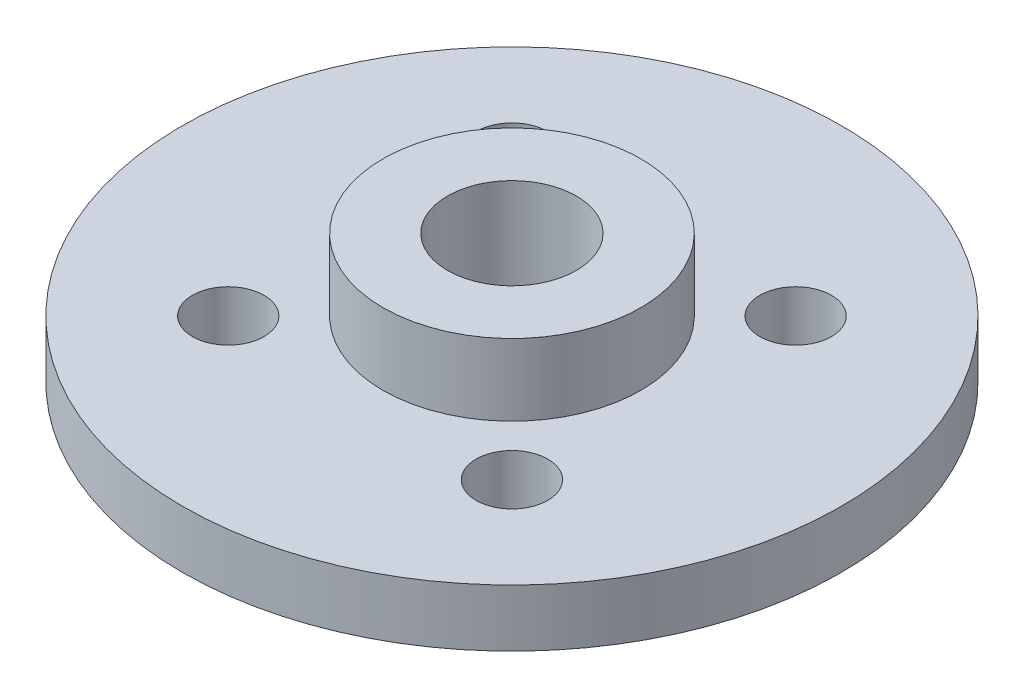
ISO-10303-21;
HEADER;
FILE_DESCRIPTION(('STEP AP214'),'2;1');
FILE_NAME('part.step','',(''),(''),'','','');
FILE_SCHEMA(('AUTOMOTIVE_DESIGN { 1 0 10303 214 1 1 1 1 }'));
ENDSEC;
DATA;
#1=APPLICATION_CONTEXT('core data for automotive mechanical design processes');
#2=APPLICATION_PROTOCOL_DEFINITION('international standard','automotive_design',2000,#1);
#3=PRODUCT_CONTEXT('',#1,'mechanical');
#4=PRODUCT('Part','Part','',(#3));
#5=PRODUCT_RELATED_PRODUCT_CATEGORY('part','',(#4));
#6=PRODUCT_DEFINITION_FORMATION('','',#4);
#7=PRODUCT_DEFINITION_CONTEXT('part definition',#1,'design');
#8=PRODUCT_DEFINITION('design','',#6,#7);
#9=PRODUCT_DEFINITION_SHAPE('','',#8);
#10=(LENGTH_UNIT() NAMED_UNIT(*) SI_UNIT(.MILLI.,.METRE.));
#11=(NAMED_UNIT(*) PLANE_ANGLE_UNIT() SI_UNIT($,.RADIAN.));
#12=(NAMED_UNIT(*) SI_UNIT($,.STERADIAN.) SOLID_ANGLE_UNIT());
#13=UNCERTAINTY_MEASURE_WITH_UNIT(LENGTH_MEASURE(1.E-05),#10,'distance_accuracy_value','');
#14=(GEOMETRIC_REPRESENTATION_CONTEXT(3) GLOBAL_UNCERTAINTY_ASSIGNED_CONTEXT((#13)) GLOBAL_UNIT_ASSIGNED_CONTEXT((#10,
#11,#12)) REPRESENTATION_CONTEXT('',''));
#15=CARTESIAN_POINT('',(0.,0.,0.));
#16=DIRECTION('',(0.,0.,1.));
#17=DIRECTION('',(1.,0.,0.));
#18=AXIS2_PLACEMENT_3D('',#15,#16,#17);
#19=CARTESIAN_POINT('',(0.,2.,0.));
#20=DIRECTION('',(0.,-1.,0.));
#21=DIRECTION('',(0.,0.,-1.));
#22=AXIS2_PLACEMENT_3D('',#19,#20,#21);
#23=CYLINDRICAL_SURFACE('',#22,1.5);
#24=CARTESIAN_POINT('',(0.,0.,0.));
#25=DIRECTION('',(0.,1.,0.));
#26=DIRECTION('',(0.,0.,1.));
#27=AXIS2_PLACEMENT_3D('',#24,#25,#26);
#28=CIRCLE('',#27,1.5);
#29=CARTESIAN_POINT('',(0.,0.,1.5));
#30=VERTEX_POINT('',#29);
#31=EDGE_CURVE('E69',#30,#30,#28,.T.);
#32=ORIENTED_EDGE('',*,*,#31,.F.);
#33=EDGE_LOOP('',(#32));
#34=FACE_BOUND('',#33,.T.);
#35=CARTESIAN_POINT('',(0.,0.900000000000001,0.));
#36=DIRECTION('',(0.,1.,0.));
#37=DIRECTION('',(0.,0.,1.));
#38=AXIS2_PLACEMENT_3D('',#35,#36,#37);
#39=CIRCLE('',#38,1.5);
#40=CARTESIAN_POINT('',(0.,0.900000000000001,1.5));
#41=VERTEX_POINT('',#40);
#42=EDGE_CURVE('E37',#41,#41,#39,.T.);
#43=ORIENTED_EDGE('',*,*,#42,.T.);
#44=EDGE_LOOP('',(#43));
#45=FACE_BOUND('',#44,.T.);
#46=ADVANCED_FACE('F33',(#34,#45),#23,.F.);
#47=CARTESIAN_POINT('',(0.,2.,0.));
#48=DIRECTION('',(0.,1.,0.));
#49=DIRECTION('',(0.,0.,1.));
#50=AXIS2_PLACEMENT_3D('',#47,#48,#49);
#51=PLANE('',#50);
#52=CARTESIAN_POINT('',(4.94974746830583,2.,4.94974746830583));
#53=DIRECTION('',(0.,1.,0.));
#54=DIRECTION('',(0.,0.,1.));
#55=AXIS2_PLACEMENT_3D('',#52,#53,#54);
#56=CIRCLE('',#55,1.25);
#57=CARTESIAN_POINT('',(4.94974746830583,2.,6.19974746830583));
#58=VERTEX_POINT('',#57);
#59=EDGE_CURVE('E57',#58,#58,#56,.T.);
#60=ORIENTED_EDGE('',*,*,#59,.F.);
#61=EDGE_LOOP('',(#60));
#62=FACE_BOUND('',#61,.T.);
#63=CARTESIAN_POINT('',(-4.94974746830583,2.,-4.94974746830583));
#64=DIRECTION('',(0.,1.,0.));
#65=DIRECTION('',(0.,0.,1.));
#66=AXIS2_PLACEMENT_3D('',#63,#64,#65);
#67=CIRCLE('',#66,1.25);
#68=CARTESIAN_POINT('',(-4.94974746830583,2.,-3.69974746830583));
#69=VERTEX_POINT('',#68);
#70=EDGE_CURVE('E46',#69,#69,#67,.T.);
#71=ORIENTED_EDGE('',*,*,#70,.F.);
#72=EDGE_LOOP('',(#71));
#73=FACE_BOUND('',#72,.T.);
#74=CARTESIAN_POINT('',(0.,2.,0.));
#75=DIRECTION('',(0.,1.,0.));
#76=DIRECTION('',(0.,0.,1.));
#77=AXIS2_PLACEMENT_3D('',#74,#75,#76);
#78=CIRCLE('',#77,11.5);
#79=CARTESIAN_POINT('',(0.,2.,11.5));
#80=VERTEX_POINT('',#79);
#81=EDGE_CURVE('E10',#80,#80,#78,.T.);
#82=ORIENTED_EDGE('',*,*,#81,.T.);
#83=EDGE_LOOP('',(#82));
#84=FACE_BOUND('',#83,.T.);
#85=CARTESIAN_POINT('',(4.94974746830583,2.,-4.94974746830583));
#86=DIRECTION('',(0.,1.,0.));
#87=DIRECTION('',(0.,0.,1.));
#88=AXIS2_PLACEMENT_3D('',#85,#86,#87);
#89=CIRCLE('',#88,1.25);
#90=CARTESIAN_POINT('',(4.94974746830583,2.,-3.69974746830583));
#91=VERTEX_POINT('',#90);
#92=EDGE_CURVE('E51',#91,#91,#89,.T.);
#93=ORIENTED_EDGE('',*,*,#92,.F.);
#94=EDGE_LOOP('',(#93));
#95=FACE_BOUND('',#94,.T.);
#96=CARTESIAN_POINT('',(-4.94974746830583,2.,4.94974746830583));
#97=DIRECTION('',(0.,1.,0.));
#98=DIRECTION('',(0.,0.,1.));
#99=AXIS2_PLACEMENT_3D('',#96,#97,#98);
#100=CIRCLE('',#99,1.25);
#101=CARTESIAN_POINT('',(-4.94974746830583,2.,6.19974746830583));
#102=VERTEX_POINT('',#101);
#103=EDGE_CURVE('E63',#102,#102,#100,.T.);
#104=ORIENTED_EDGE('',*,*,#103,.F.);
#105=EDGE_LOOP('',(#104));
#106=FACE_BOUND('',#105,.T.);
#107=CARTESIAN_POINT('',(0.,2.,0.));
#108=DIRECTION('',(0.,1.,0.));
#109=DIRECTION('',(0.,0.,1.));
#110=AXIS2_PLACEMENT_3D('',#107,#108,#109);
#111=CIRCLE('',#110,4.5);
#112=CARTESIAN_POINT('',(0.,2.,4.5));
#113=VERTEX_POINT('',#112);
#114=EDGE_CURVE('E75',#113,#113,#111,.T.);
#115=ORIENTED_EDGE('',*,*,#114,.F.);
#116=EDGE_LOOP('',(#115));
#117=FACE_BOUND('',#116,.T.);
#118=ADVANCED_FACE('F102',(#62,#73,#84,#95,#106,#117),#51,.T.);
#119=CARTESIAN_POINT('',(0.,0.,0.));
#120=DIRECTION('',(0.,1.,0.));
#121=DIRECTION('',(0.,0.,1.));
#122=AXIS2_PLACEMENT_3D('',#119,#120,#121);
#123=PLANE('',#122);
#124=CARTESIAN_POINT('',(0.,0.,0.));
#125=DIRECTION('',(0.,1.,0.));
#126=DIRECTION('',(0.,0.,1.));
#127=AXIS2_PLACEMENT_3D('',#124,#125,#126);
#128=CIRCLE('',#127,11.5);
#129=CARTESIAN_POINT('',(0.,0.,11.5));
#130=VERTEX_POINT('',#129);
#131=EDGE_CURVE('E41',#130,#130,#128,.T.);
#132=ORIENTED_EDGE('',*,*,#131,.F.);
#133=EDGE_LOOP('',(#132));
#134=FACE_BOUND('',#133,.T.);
#135=CARTESIAN_POINT('',(-4.94974746830583,0.,-4.94974746830583));
#136=DIRECTION('',(0.,1.,0.));
#137=DIRECTION('',(0.,0.,1.));
#138=AXIS2_PLACEMENT_3D('',#135,#136,#137);
#139=CIRCLE('',#138,1.25);
#140=CARTESIAN_POINT('',(-4.94974746830583,0.,-3.69974746830583));
#141=VERTEX_POINT('',#140);
#142=EDGE_CURVE('E48',#141,#141,#139,.T.);
#143=ORIENTED_EDGE('',*,*,#142,.T.);
#144=EDGE_LOOP('',(#143));
#145=FACE_BOUND('',#144,.T.);
#146=CARTESIAN_POINT('',(4.94974746830583,0.,-4.94974746830583));
#147=DIRECTION('',(0.,1.,0.));
#148=DIRECTION('',(0.,0.,1.));
#149=AXIS2_PLACEMENT_3D('',#146,#147,#148);
#150=CIRCLE('',#149,1.25);
#151=CARTESIAN_POINT('',(4.94974746830583,0.,-3.69974746830583));
#152=VERTEX_POINT('',#151);
#153=EDGE_CURVE('E54',#152,#152,#150,.T.);
#154=ORIENTED_EDGE('',*,*,#153,.T.);
#155=EDGE_LOOP('',(#154));
#156=FACE_BOUND('',#155,.T.);
#157=CARTESIAN_POINT('',(4.94974746830583,0.,4.94974746830583));
#158=DIRECTION('',(0.,1.,0.));
#159=DIRECTION('',(0.,0.,1.));
#160=AXIS2_PLACEMENT_3D('',#157,#158,#159);
#161=CIRCLE('',#160,1.25);
#162=CARTESIAN_POINT('',(4.94974746830583,0.,6.19974746830583));
#163=VERTEX_POINT('',#162);
#164=EDGE_CURVE('E60',#163,#163,#161,.T.);
#165=ORIENTED_EDGE('',*,*,#164,.T.);
#166=EDGE_LOOP('',(#165));
#167=FACE_BOUND('',#166,.T.);
#168=CARTESIAN_POINT('',(-4.94974746830583,0.,4.94974746830583));
#169=DIRECTION('',(0.,1.,0.));
#170=DIRECTION('',(0.,0.,1.));
#171=AXIS2_PLACEMENT_3D('',#168,#169,#170);
#172=CIRCLE('',#171,1.25);
#173=CARTESIAN_POINT('',(-4.94974746830583,0.,6.19974746830583));
#174=VERTEX_POINT('',#173);
#175=EDGE_CURVE('E66',#174,#174,#172,.T.);
#176=ORIENTED_EDGE('',*,*,#175,.T.);
#177=EDGE_LOOP('',(#176));
#178=FACE_BOUND('',#177,.T.);
#179=ORIENTED_EDGE('',*,*,#31,.T.);
#180=EDGE_LOOP('',(#179));
#181=FACE_BOUND('',#180,.T.);
#182=ADVANCED_FACE('F108',(#134,#145,#156,#167,#178,#181),#123,.F.);
#183=CARTESIAN_POINT('',(0.,2.,0.));
#184=DIRECTION('',(0.,-1.,0.));
#185=DIRECTION('',(0.,0.,-1.));
#186=AXIS2_PLACEMENT_3D('',#183,#184,#185);
#187=CYLINDRICAL_SURFACE('',#186,11.5);
#188=ORIENTED_EDGE('',*,*,#81,.F.);
#189=EDGE_LOOP('',(#188));
#190=FACE_BOUND('',#189,.T.);
#191=ORIENTED_EDGE('',*,*,#131,.T.);
#192=EDGE_LOOP('',(#191));
#193=FACE_BOUND('',#192,.T.);
#194=ADVANCED_FACE('F35',(#190,#193),#187,.T.);
#195=CARTESIAN_POINT('',(-4.94974746830583,2.,-4.94974746830583));
#196=DIRECTION('',(0.,-1.,0.));
#197=DIRECTION('',(0.,0.,-1.));
#198=AXIS2_PLACEMENT_3D('',#195,#196,#197);
#199=CYLINDRICAL_SURFACE('',#198,1.25);
#200=ORIENTED_EDGE('',*,*,#70,.T.);
#201=EDGE_LOOP('',(#200));
#202=FACE_BOUND('',#201,.T.);
#203=ORIENTED_EDGE('',*,*,#142,.F.);
#204=EDGE_LOOP('',(#203));
#205=FACE_BOUND('',#204,.T.);
#206=ADVANCED_FACE('F127',(#202,#205),#199,.F.);
#207=CARTESIAN_POINT('',(4.94974746830583,2.,-4.94974746830583));
#208=DIRECTION('',(0.,-1.,0.));
#209=DIRECTION('',(0.,0.,-1.));
#210=AXIS2_PLACEMENT_3D('',#207,#208,#209);
#211=CYLINDRICAL_SURFACE('',#210,1.25);
#212=ORIENTED_EDGE('',*,*,#92,.T.);
#213=EDGE_LOOP('',(#212));
#214=FACE_BOUND('',#213,.T.);
#215=ORIENTED_EDGE('',*,*,#153,.F.);
#216=EDGE_LOOP('',(#215));
#217=FACE_BOUND('',#216,.T.);
#218=ADVANCED_FACE('F123',(#214,#217),#211,.F.);
#219=CARTESIAN_POINT('',(4.94974746830583,2.,4.94974746830583));
#220=DIRECTION('',(0.,-1.,0.));
#221=DIRECTION('',(0.,0.,-1.));
#222=AXIS2_PLACEMENT_3D('',#219,#220,#221);
#223=CYLINDRICAL_SURFACE('',#222,1.25);
#224=ORIENTED_EDGE('',*,*,#59,.T.);
#225=EDGE_LOOP('',(#224));
#226=FACE_BOUND('',#225,.T.);
#227=ORIENTED_EDGE('',*,*,#164,.F.);
#228=EDGE_LOOP('',(#227));
#229=FACE_BOUND('',#228,.T.);
#230=ADVANCED_FACE('F119',(#226,#229),#223,.F.);
#231=CARTESIAN_POINT('',(-4.94974746830583,2.,4.94974746830583));
#232=DIRECTION('',(0.,-1.,0.));
#233=DIRECTION('',(0.,0.,-1.));
#234=AXIS2_PLACEMENT_3D('',#231,#232,#233);
#235=CYLINDRICAL_SURFACE('',#234,1.25);
#236=ORIENTED_EDGE('',*,*,#103,.T.);
#237=EDGE_LOOP('',(#236));
#238=FACE_BOUND('',#237,.T.);
#239=ORIENTED_EDGE('',*,*,#175,.F.);
#240=EDGE_LOOP('',(#239));
#241=FACE_BOUND('',#240,.T.);
#242=ADVANCED_FACE('F115',(#238,#241),#235,.F.);
#243=CARTESIAN_POINT('',(0.,4.5,0.));
#244=DIRECTION('',(0.,1.,0.));
#245=DIRECTION('',(0.,0.,1.));
#246=AXIS2_PLACEMENT_3D('',#243,#244,#245);
#247=PLANE('',#246);
#248=CARTESIAN_POINT('',(0.,4.5,0.));
#249=DIRECTION('',(0.,1.,0.));
#250=DIRECTION('',(0.,0.,1.));
#251=AXIS2_PLACEMENT_3D('',#248,#249,#250);
#252=CIRCLE('',#251,2.25);
#253=CARTESIAN_POINT('',(0.,4.5,2.25));
#254=VERTEX_POINT('',#253);
#255=EDGE_CURVE('E80',#254,#254,#252,.T.);
#256=ORIENTED_EDGE('',*,*,#255,.F.);
#257=EDGE_LOOP('',(#256));
#258=FACE_BOUND('',#257,.T.);
#259=CARTESIAN_POINT('',(0.,4.5,0.));
#260=DIRECTION('',(0.,1.,0.));
#261=DIRECTION('',(0.,0.,1.));
#262=AXIS2_PLACEMENT_3D('',#259,#260,#261);
#263=CIRCLE('',#262,4.5);
#264=CARTESIAN_POINT('',(0.,4.5,4.5));
#265=VERTEX_POINT('',#264);
#266=EDGE_CURVE('E74',#265,#265,#263,.T.);
#267=ORIENTED_EDGE('',*,*,#266,.T.);
#268=EDGE_LOOP('',(#267));
#269=FACE_BOUND('',#268,.T.);
#270=ADVANCED_FACE('F118',(#258,#269),#247,.T.);
#271=CARTESIAN_POINT('',(0.,4.5,0.));
#272=DIRECTION('',(0.,-1.,0.));
#273=DIRECTION('',(0.,0.,-1.));
#274=AXIS2_PLACEMENT_3D('',#271,#272,#273);
#275=CYLINDRICAL_SURFACE('',#274,4.5);
#276=ORIENTED_EDGE('',*,*,#266,.F.);
#277=EDGE_LOOP('',(#276));
#278=FACE_BOUND('',#277,.T.);
#279=ORIENTED_EDGE('',*,*,#114,.T.);
#280=EDGE_LOOP('',(#279));
#281=FACE_BOUND('',#280,.T.);
#282=ADVANCED_FACE('F98',(#278,#281),#275,.T.);
#283=CARTESIAN_POINT('',(0.,0.900000000000001,0.));
#284=DIRECTION('',(0.,1.,0.));
#285=DIRECTION('',(0.,0.,1.));
#286=AXIS2_PLACEMENT_3D('',#283,#284,#285);
#287=CYLINDRICAL_SURFACE('',#286,2.25);
#288=CARTESIAN_POINT('',(0.,0.900000000000001,0.));
#289=DIRECTION('',(0.,1.,0.));
#290=DIRECTION('',(0.,0.,1.));
#291=AXIS2_PLACEMENT_3D('',#288,#289,#290);
#292=CIRCLE('',#291,2.25);
#293=CARTESIAN_POINT('',(0.,0.900000000000001,2.25));
#294=VERTEX_POINT('',#293);
#295=EDGE_CURVE('E83',#294,#294,#292,.T.);
#296=ORIENTED_EDGE('',*,*,#295,.F.);
#297=EDGE_LOOP('',(#296));
#298=FACE_BOUND('',#297,.T.);
#299=ORIENTED_EDGE('',*,*,#255,.T.);
#300=EDGE_LOOP('',(#299));
#301=FACE_BOUND('',#300,.T.);
#302=ADVANCED_FACE('F93',(#298,#301),#287,.F.);
#303=CARTESIAN_POINT('',(0.,0.900000000000001,0.));
#304=DIRECTION('',(0.,1.,0.));
#305=DIRECTION('',(0.,0.,1.));
#306=AXIS2_PLACEMENT_3D('',#303,#304,#305);
#307=PLANE('',#306);
#308=ORIENTED_EDGE('',*,*,#42,.F.);
#309=EDGE_LOOP('',(#308));
#310=FACE_BOUND('',#309,.T.);
#311=ORIENTED_EDGE('',*,*,#295,.T.);
#312=EDGE_LOOP('',(#311));
#313=FACE_BOUND('',#312,.T.);
#314=ADVANCED_FACE('F91',(#310,#313),#307,.T.);
#315=CLOSED_SHELL('',(#46,#118,#182,#194,#206,#218,#230,#242,#270,#282,#302,#314));
#316=MANIFOLD_SOLID_BREP('B2',#315);
#317=ADVANCED_BREP_SHAPE_REPRESENTATION('',(#18,#316),#14);
#318=SHAPE_DEFINITION_REPRESENTATION(#9,#317);
ENDSEC;
END-ISO-10303-21;
